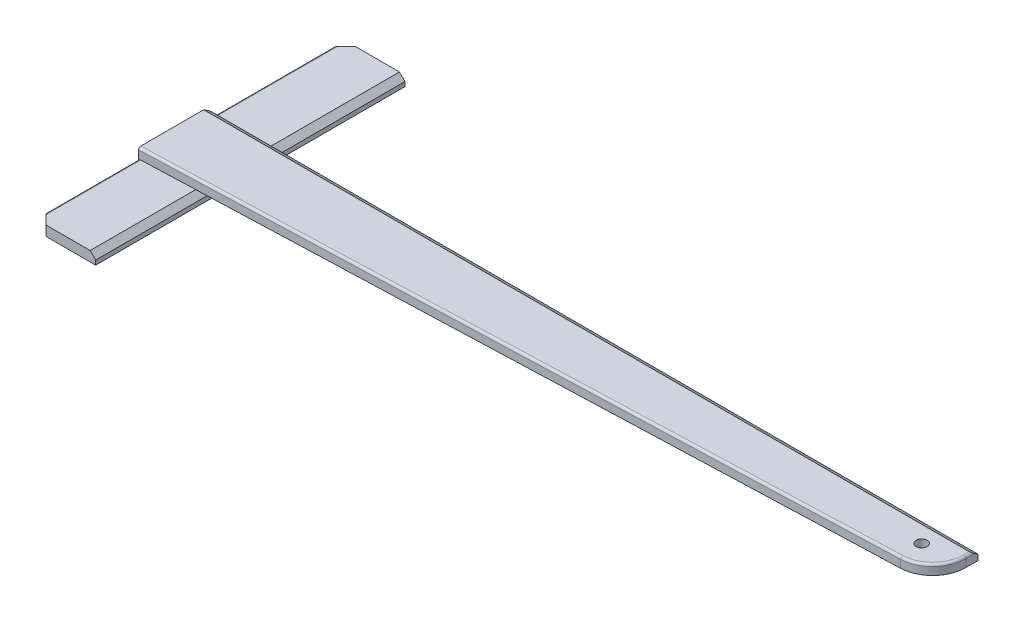
ISO-10303-21;
HEADER;
FILE_DESCRIPTION(('STEP AP214'),'2;1');
FILE_NAME('part.step','',(''),(''),'','','');
FILE_SCHEMA(('AUTOMOTIVE_DESIGN { 1 0 10303 214 1 1 1 1 }'));
ENDSEC;
DATA;
#1=APPLICATION_CONTEXT('core data for automotive mechanical design processes');
#2=APPLICATION_PROTOCOL_DEFINITION('international standard','automotive_design',2000,#1);
#3=PRODUCT_CONTEXT('',#1,'mechanical');
#4=PRODUCT('Part','Part','',(#3));
#5=PRODUCT_RELATED_PRODUCT_CATEGORY('part','',(#4));
#6=PRODUCT_DEFINITION_FORMATION('','',#4);
#7=PRODUCT_DEFINITION_CONTEXT('part definition',#1,'design');
#8=PRODUCT_DEFINITION('design','',#6,#7);
#9=PRODUCT_DEFINITION_SHAPE('','',#8);
#10=(LENGTH_UNIT() NAMED_UNIT(*) SI_UNIT(.MILLI.,.METRE.));
#11=(NAMED_UNIT(*) PLANE_ANGLE_UNIT() SI_UNIT($,.RADIAN.));
#12=(NAMED_UNIT(*) SI_UNIT($,.STERADIAN.) SOLID_ANGLE_UNIT());
#13=UNCERTAINTY_MEASURE_WITH_UNIT(LENGTH_MEASURE(1.E-05),#10,'distance_accuracy_value','');
#14=(GEOMETRIC_REPRESENTATION_CONTEXT(3) GLOBAL_UNCERTAINTY_ASSIGNED_CONTEXT((#13)) GLOBAL_UNIT_ASSIGNED_CONTEXT((#10,
#11,#12)) REPRESENTATION_CONTEXT('',''));
#15=CARTESIAN_POINT('',(0.,0.,0.));
#16=DIRECTION('',(0.,0.,1.));
#17=DIRECTION('',(1.,0.,0.));
#18=AXIS2_PLACEMENT_3D('',#15,#16,#17);
#19=CARTESIAN_POINT('',(0.,228.6,0.));
#20=DIRECTION('',(0.,-1.,0.));
#21=DIRECTION('',(0.,0.,-1.));
#22=AXIS2_PLACEMENT_3D('',#19,#20,#21);
#23=PLANE('',#22);
#24=DIRECTION('',(0.707106781186549,0.,-0.707106781186546));
#25=VECTOR('',#24,1.);
#26=CARTESIAN_POINT('',(-1.28468664278054E-12,228.6,-6858.));
#27=LINE('',#26,#25);
#28=CARTESIAN_POINT('',(253.999999999999,228.6,-7112.));
#29=VERTEX_POINT('',#28);
#30=CARTESIAN_POINT('',(50.7999999999987,228.6,-6908.8));
#31=VERTEX_POINT('',#30);
#32=EDGE_CURVE('E333',#29,#31,#27,.F.);
#33=ORIENTED_EDGE('',*,*,#32,.T.);
#34=DIRECTION('',(0.,0.,1.));
#35=VECTOR('',#34,1.);
#36=CARTESIAN_POINT('',(50.8,228.6,0.));
#37=LINE('',#36,#35);
#38=CARTESIAN_POINT('',(50.7999999999992,228.6,-4032.28768745978));
#39=VERTEX_POINT('',#38);
#40=EDGE_CURVE('E239',#31,#39,#37,.T.);
#41=ORIENTED_EDGE('',*,*,#40,.T.);
#42=DIRECTION('',(-1.,0.,0.));
#43=VECTOR('',#42,1.);
#44=CARTESIAN_POINT('',(-7.55355224836395E-13,228.6,-4032.28768745978));
#45=LINE('',#44,#43);
#46=CARTESIAN_POINT('',(1270.,228.6,-4032.28768745978));
#47=VERTEX_POINT('',#46);
#48=EDGE_CURVE('E195',#47,#39,#45,.T.);
#49=ORIENTED_EDGE('',*,*,#48,.F.);
#50=DIRECTION('',(0.,0.,-1.));
#51=VECTOR('',#50,1.);
#52=CARTESIAN_POINT('',(1270.,228.6,-2.37904933848248E-13));
#53=LINE('',#52,#51);
#54=CARTESIAN_POINT('',(1270.,228.6,-7112.));
#55=VERTEX_POINT('',#54);
#56=EDGE_CURVE('E316',#47,#55,#53,.T.);
#57=ORIENTED_EDGE('',*,*,#56,.T.);
#58=DIRECTION('',(-1.,0.,0.));
#59=VECTOR('',#58,1.);
#60=CARTESIAN_POINT('',(-1.33226762955019E-12,228.6,-7112.));
#61=LINE('',#60,#59);
#62=EDGE_CURVE('E301',#55,#29,#61,.T.);
#63=ORIENTED_EDGE('',*,*,#62,.T.);
#64=EDGE_LOOP('',(#33,#41,#49,#57,#63));
#65=FACE_BOUND('',#64,.T.);
#66=ADVANCED_FACE('F37',(#65),#23,.F.);
#67=DIRECTION('',(0.999353662725428,0.,-0.035947973479332));
#68=VECTOR('',#67,1.);
#69=CARTESIAN_POINT('',(17653.,228.6,-3016.28768745978));
#70=LINE('',#69,#68);
#71=CARTESIAN_POINT('',(50.8000000000024,228.6,-2383.11502558927));
#72=VERTEX_POINT('',#71);
#73=CARTESIAN_POINT('',(1270.,228.6,-2426.97114069719));
#74=VERTEX_POINT('',#73);
#75=EDGE_CURVE('E175',#72,#74,#70,.T.);
#76=ORIENTED_EDGE('',*,*,#75,.F.);
#77=DIRECTION('',(0.,0.,1.));
#78=VECTOR('',#77,1.);
#79=CARTESIAN_POINT('',(50.8,228.6,0.));
#80=LINE('',#79,#78);
#81=CARTESIAN_POINT('',(50.8,228.6,-203.200000000001));
#82=VERTEX_POINT('',#81);
#83=EDGE_CURVE('E251',#72,#82,#80,.T.);
#84=ORIENTED_EDGE('',*,*,#83,.T.);
#85=DIRECTION('',(-0.707106781186546,0.,-0.707106781186549));
#86=VECTOR('',#85,1.);
#87=CARTESIAN_POINT('',(254.,228.6,0.));
#88=LINE('',#87,#86);
#89=CARTESIAN_POINT('',(254.,228.6,0.));
#90=VERTEX_POINT('',#89);
#91=EDGE_CURVE('E202',#82,#90,#88,.F.);
#92=ORIENTED_EDGE('',*,*,#91,.T.);
#93=DIRECTION('',(1.,0.,0.));
#94=VECTOR('',#93,1.);
#95=CARTESIAN_POINT('',(0.,228.6,0.));
#96=LINE('',#95,#94);
#97=CARTESIAN_POINT('',(1270.,228.6,0.));
#98=VERTEX_POINT('',#97);
#99=EDGE_CURVE('E299',#90,#98,#96,.T.);
#100=ORIENTED_EDGE('',*,*,#99,.T.);
#101=EDGE_CURVE('E317',#98,#74,#53,.T.);
#102=ORIENTED_EDGE('',*,*,#101,.T.);
#103=EDGE_LOOP('',(#76,#84,#92,#100,#102));
#104=FACE_BOUND('',#103,.T.);
#105=ADVANCED_FACE('F354',(#104),#23,.F.);
#106=CARTESIAN_POINT('',(0.,228.6,0.));
#107=DIRECTION('',(1.,0.,0.));
#108=DIRECTION('',(0.,0.,-1.));
#109=AXIS2_PLACEMENT_3D('',#106,#107,#108);
#110=PLANE('',#109);
#111=DIRECTION('',(0.,-1.,0.));
#112=VECTOR('',#111,1.);
#113=CARTESIAN_POINT('',(-7.55355224836395E-13,457.2,-4032.28768745978));
#114=LINE('',#113,#112);
#115=CARTESIAN_POINT('',(-7.55355224836395E-13,355.600000000002,-4032.28768745978));
#116=VERTEX_POINT('',#115);
#117=CARTESIAN_POINT('',(-7.55355224836395E-13,177.8,-4032.28768745978));
#118=VERTEX_POINT('',#117);
#119=EDGE_CURVE('E290',#116,#118,#114,.T.);
#120=ORIENTED_EDGE('',*,*,#119,.T.);
#121=DIRECTION('',(0.,0.,1.));
#122=VECTOR('',#121,1.);
#123=CARTESIAN_POINT('',(0.,177.8,0.));
#124=LINE('',#123,#122);
#125=CARTESIAN_POINT('',(-1.28468664278054E-12,177.8,-6858.));
#126=VERTEX_POINT('',#125);
#127=EDGE_CURVE('E247',#118,#126,#124,.F.);
#128=ORIENTED_EDGE('',*,*,#127,.T.);
#129=DIRECTION('',(0.,-1.,0.));
#130=VECTOR('',#129,1.);
#131=CARTESIAN_POINT('',(-1.28468664278054E-12,228.6,-6858.));
#132=LINE('',#131,#130);
#133=CARTESIAN_POINT('',(-1.28468664278054E-12,0.,-6858.));
#134=VERTEX_POINT('',#133);
#135=EDGE_CURVE('E327',#126,#134,#132,.T.);
#136=ORIENTED_EDGE('',*,*,#135,.T.);
#137=DIRECTION('',(0.,0.,1.));
#138=VECTOR('',#137,1.);
#139=CARTESIAN_POINT('',(0.,0.,0.));
#140=LINE('',#139,#138);
#141=CARTESIAN_POINT('',(0.,0.,-254.000000000001));
#142=VERTEX_POINT('',#141);
#143=EDGE_CURVE('E292',#134,#142,#140,.T.);
#144=ORIENTED_EDGE('',*,*,#143,.T.);
#145=DIRECTION('',(0.,1.,0.));
#146=VECTOR('',#145,1.);
#147=CARTESIAN_POINT('',(0.,228.6,-254.000000000001));
#148=LINE('',#147,#146);
#149=CARTESIAN_POINT('',(0.,177.8,-254.000000000001));
#150=VERTEX_POINT('',#149);
#151=EDGE_CURVE('E206',#142,#150,#148,.T.);
#152=ORIENTED_EDGE('',*,*,#151,.T.);
#153=DIRECTION('',(0.,0.,1.));
#154=VECTOR('',#153,1.);
#155=CARTESIAN_POINT('',(0.,177.8,0.));
#156=LINE('',#155,#154);
#157=CARTESIAN_POINT('',(-1.28468664278054E-12,177.8,-2381.28768745978));
#158=VERTEX_POINT('',#157);
#159=EDGE_CURVE('E244',#150,#158,#156,.F.);
#160=ORIENTED_EDGE('',*,*,#159,.T.);
#161=DIRECTION('',(0.,-1.,0.));
#162=VECTOR('',#161,1.);
#163=CARTESIAN_POINT('',(-1.28468664278054E-12,457.2,-2381.28768745978));
#164=LINE('',#163,#162);
#165=CARTESIAN_POINT('',(-1.28468664278054E-12,406.4,-2381.28768745978));
#166=VERTEX_POINT('',#165);
#167=EDGE_CURVE('E185',#166,#158,#164,.T.);
#168=ORIENTED_EDGE('',*,*,#167,.F.);
#169=CARTESIAN_POINT('',(-4.57966997657877E-13,406.4,-2432.12054262884));
#170=DIRECTION('',(1.,0.,0.));
#171=DIRECTION('',(0.,0.,-1.));
#172=AXIS2_PLACEMENT_3D('',#169,#170,#171);
#173=ELLIPSE('',#172,50.8328551690687,50.8);
#174=CARTESIAN_POINT('',(-1.26838898844693E-12,457.2,-2432.12054262884));
#175=VERTEX_POINT('',#174);
#176=EDGE_CURVE('E242',#166,#175,#173,.F.);
#177=ORIENTED_EDGE('',*,*,#176,.T.);
#178=DIRECTION('',(0.,0.,1.));
#179=VECTOR('',#178,1.);
#180=CARTESIAN_POINT('',(-1.28468664278054E-12,457.2,-2381.28768745978));
#181=LINE('',#180,#179);
#182=CARTESIAN_POINT('',(-8.04216586492776E-13,457.2,-3879.88768745978));
#183=VERTEX_POINT('',#182);
#184=EDGE_CURVE('E174',#183,#175,#181,.T.);
#185=ORIENTED_EDGE('',*,*,#184,.F.);
#186=DIRECTION('',(0.,0.554700196225234,0.832050294337841));
#187=VECTOR('',#186,1.);
#188=CARTESIAN_POINT('',(-7.26806632774607E-13,457.2,-3879.88768745978));
#189=LINE('',#188,#187);
#190=EDGE_CURVE('E204',#183,#116,#189,.F.);
#191=ORIENTED_EDGE('',*,*,#190,.T.);
#192=EDGE_LOOP('',(#120,#128,#136,#144,#152,#160,#168,#177,#185,#191));
#193=FACE_BOUND('',#192,.T.);
#194=ADVANCED_FACE('F289',(#193),#110,.F.);
#195=CARTESIAN_POINT('',(0.,228.6,0.));
#196=DIRECTION('',(0.,0.,-1.));
#197=DIRECTION('',(-1.,0.,0.));
#198=AXIS2_PLACEMENT_3D('',#195,#196,#197);
#199=PLANE('',#198);
#200=ORIENTED_EDGE('',*,*,#99,.F.);
#201=DIRECTION('',(0.,-1.,0.));
#202=VECTOR('',#201,1.);
#203=CARTESIAN_POINT('',(254.,228.6,0.));
#204=LINE('',#203,#202);
#205=CARTESIAN_POINT('',(254.,0.,0.));
#206=VERTEX_POINT('',#205);
#207=EDGE_CURVE('E336',#90,#206,#204,.T.);
#208=ORIENTED_EDGE('',*,*,#207,.T.);
#209=DIRECTION('',(1.,0.,0.));
#210=VECTOR('',#209,1.);
#211=CARTESIAN_POINT('',(0.,0.,0.));
#212=LINE('',#211,#210);
#213=CARTESIAN_POINT('',(1397.,0.,0.));
#214=VERTEX_POINT('',#213);
#215=EDGE_CURVE('E295',#206,#214,#212,.T.);
#216=ORIENTED_EDGE('',*,*,#215,.T.);
#217=DIRECTION('',(0.,-1.,0.));
#218=VECTOR('',#217,1.);
#219=CARTESIAN_POINT('',(1397.,228.6,0.));
#220=LINE('',#219,#218);
#221=CARTESIAN_POINT('',(1397.,101.599999999999,0.));
#222=VERTEX_POINT('',#221);
#223=EDGE_CURVE('E313',#222,#214,#220,.T.);
#224=ORIENTED_EDGE('',*,*,#223,.F.);
#225=DIRECTION('',(0.707106781186545,-0.70710678118655,0.));
#226=VECTOR('',#225,1.);
#227=CARTESIAN_POINT('',(1270.,228.6,0.));
#228=LINE('',#227,#226);
#229=EDGE_CURVE('E324',#222,#98,#228,.F.);
#230=ORIENTED_EDGE('',*,*,#229,.T.);
#231=EDGE_LOOP('',(#200,#208,#216,#224,#230));
#232=FACE_BOUND('',#231,.T.);
#233=ADVANCED_FACE('F350',(#232),#199,.F.);
#234=CARTESIAN_POINT('',(1397.,228.6,0.));
#235=DIRECTION('',(-1.,0.,0.));
#236=DIRECTION('',(0.,0.,1.));
#237=AXIS2_PLACEMENT_3D('',#234,#235,#236);
#238=PLANE('',#237);
#239=DIRECTION('',(0.,-1.,0.));
#240=VECTOR('',#239,1.);
#241=CARTESIAN_POINT('',(1397.,228.6,-7112.));
#242=LINE('',#241,#240);
#243=CARTESIAN_POINT('',(1397.,101.599999999999,-7112.));
#244=VERTEX_POINT('',#243);
#245=CARTESIAN_POINT('',(1397.,0.,-7112.));
#246=VERTEX_POINT('',#245);
#247=EDGE_CURVE('E304',#244,#246,#242,.T.);
#248=ORIENTED_EDGE('',*,*,#247,.F.);
#249=DIRECTION('',(0.,0.,1.));
#250=VECTOR('',#249,1.);
#251=CARTESIAN_POINT('',(1397.,101.599999999999,0.));
#252=LINE('',#251,#250);
#253=EDGE_CURVE('E322',#244,#222,#252,.T.);
#254=ORIENTED_EDGE('',*,*,#253,.T.);
#255=ORIENTED_EDGE('',*,*,#223,.T.);
#256=DIRECTION('',(0.,0.,-1.));
#257=VECTOR('',#256,1.);
#258=CARTESIAN_POINT('',(1397.,0.,0.));
#259=LINE('',#258,#257);
#260=EDGE_CURVE('E307',#214,#246,#259,.T.);
#261=ORIENTED_EDGE('',*,*,#260,.T.);
#262=EDGE_LOOP('',(#248,#254,#255,#261));
#263=FACE_BOUND('',#262,.T.);
#264=ADVANCED_FACE('F386',(#263),#238,.F.);
#265=CARTESIAN_POINT('',(-1.33226762955019E-12,228.6,-7112.));
#266=DIRECTION('',(0.,0.,1.));
#267=DIRECTION('',(1.,0.,0.));
#268=AXIS2_PLACEMENT_3D('',#265,#266,#267);
#269=PLANE('',#268);
#270=DIRECTION('',(-1.,0.,0.));
#271=VECTOR('',#270,1.);
#272=CARTESIAN_POINT('',(-1.33226762955019E-12,0.,-7112.));
#273=LINE('',#272,#271);
#274=CARTESIAN_POINT('',(253.999999999999,0.,-7112.));
#275=VERTEX_POINT('',#274);
#276=EDGE_CURVE('E302',#246,#275,#273,.T.);
#277=ORIENTED_EDGE('',*,*,#276,.T.);
#278=DIRECTION('',(0.,1.,0.));
#279=VECTOR('',#278,1.);
#280=CARTESIAN_POINT('',(253.999999999999,228.6,-7112.));
#281=LINE('',#280,#279);
#282=EDGE_CURVE('E331',#275,#29,#281,.T.);
#283=ORIENTED_EDGE('',*,*,#282,.T.);
#284=ORIENTED_EDGE('',*,*,#62,.F.);
#285=DIRECTION('',(-0.707106781186545,0.70710678118655,0.));
#286=VECTOR('',#285,1.);
#287=CARTESIAN_POINT('',(1270.,228.599999999999,-7112.));
#288=LINE('',#287,#286);
#289=EDGE_CURVE('E320',#55,#244,#288,.F.);
#290=ORIENTED_EDGE('',*,*,#289,.T.);
#291=ORIENTED_EDGE('',*,*,#247,.T.);
#292=EDGE_LOOP('',(#277,#283,#284,#290,#291));
#293=FACE_BOUND('',#292,.T.);
#294=ADVANCED_FACE('F383',(#293),#269,.F.);
#295=CARTESIAN_POINT('',(0.,0.,0.));
#296=DIRECTION('',(0.,-1.,0.));
#297=DIRECTION('',(0.,0.,-1.));
#298=AXIS2_PLACEMENT_3D('',#295,#296,#297);
#299=PLANE('',#298);
#300=ORIENTED_EDGE('',*,*,#215,.F.);
#301=DIRECTION('',(0.707106781186546,0.,0.707106781186549));
#302=VECTOR('',#301,1.);
#303=CARTESIAN_POINT('',(127.000000000001,0.,-127.));
#304=LINE('',#303,#302);
#305=EDGE_CURVE('E212',#206,#142,#304,.F.);
#306=ORIENTED_EDGE('',*,*,#305,.T.);
#307=ORIENTED_EDGE('',*,*,#143,.F.);
#308=DIRECTION('',(-0.707106781186549,0.,0.707106781186546));
#309=VECTOR('',#308,1.);
#310=CARTESIAN_POINT('',(-3429.,0.,-3429.00000000001));
#311=LINE('',#310,#309);
#312=EDGE_CURVE('E329',#134,#275,#311,.F.);
#313=ORIENTED_EDGE('',*,*,#312,.T.);
#314=ORIENTED_EDGE('',*,*,#276,.F.);
#315=ORIENTED_EDGE('',*,*,#260,.F.);
#316=EDGE_LOOP('',(#300,#306,#307,#313,#314,#315));
#317=FACE_BOUND('',#316,.T.);
#318=ADVANCED_FACE('F341',(#317),#299,.T.);
#319=CARTESIAN_POINT('',(1270.,228.6,-2.37904933848248E-13));
#320=DIRECTION('',(-0.70710678118655,-0.707106781186545,0.));
#321=DIRECTION('',(0.,0.,-1.));
#322=AXIS2_PLACEMENT_3D('',#319,#320,#321);
#323=PLANE('',#322);
#324=ORIENTED_EDGE('',*,*,#229,.F.);
#325=ORIENTED_EDGE('',*,*,#253,.F.);
#326=ORIENTED_EDGE('',*,*,#289,.F.);
#327=ORIENTED_EDGE('',*,*,#56,.F.);
#328=EDGE_CURVE('E191',#74,#47,#53,.T.);
#329=ORIENTED_EDGE('',*,*,#328,.F.);
#330=ORIENTED_EDGE('',*,*,#101,.F.);
#331=EDGE_LOOP('',(#324,#325,#326,#327,#329,#330));
#332=FACE_BOUND('',#331,.T.);
#333=ADVANCED_FACE('F357',(#332),#323,.F.);
#334=CARTESIAN_POINT('',(-1.28468664278054E-12,228.6,-6858.));
#335=DIRECTION('',(0.707106781186546,0.,0.707106781186549));
#336=DIRECTION('',(0.,-1.,0.));
#337=AXIS2_PLACEMENT_3D('',#334,#335,#336);
#338=PLANE('',#337);
#339=ORIENTED_EDGE('',*,*,#135,.F.);
#340=CARTESIAN_POINT('',(50.7999999999987,177.8,-6908.8));
#341=DIRECTION('',(0.707106781186546,0.,0.707106781186549));
#342=DIRECTION('',(-0.707106781186549,0.,0.707106781186546));
#343=AXIS2_PLACEMENT_3D('',#340,#341,#342);
#344=ELLIPSE('',#343,71.8420489685531,50.8);
#345=EDGE_CURVE('E249',#126,#31,#344,.F.);
#346=ORIENTED_EDGE('',*,*,#345,.T.);
#347=ORIENTED_EDGE('',*,*,#32,.F.);
#348=ORIENTED_EDGE('',*,*,#282,.F.);
#349=ORIENTED_EDGE('',*,*,#312,.F.);
#350=EDGE_LOOP('',(#339,#346,#347,#348,#349));
#351=FACE_BOUND('',#350,.T.);
#352=ADVANCED_FACE('F397',(#351),#338,.F.);
#353=CARTESIAN_POINT('',(254.,228.6,0.));
#354=DIRECTION('',(0.707106781186549,0.,-0.707106781186546));
#355=DIRECTION('',(0.,-1.,0.));
#356=AXIS2_PLACEMENT_3D('',#353,#354,#355);
#357=PLANE('',#356);
#358=ORIENTED_EDGE('',*,*,#91,.F.);
#359=CARTESIAN_POINT('',(50.8,177.8,-203.200000000001));
#360=DIRECTION('',(0.707106781186549,0.,-0.707106781186546));
#361=DIRECTION('',(0.707106781186546,0.,0.707106781186549));
#362=AXIS2_PLACEMENT_3D('',#359,#360,#361);
#363=ELLIPSE('',#362,71.8420489685534,50.8);
#364=EDGE_CURVE('E54',#82,#150,#363,.F.);
#365=ORIENTED_EDGE('',*,*,#364,.T.);
#366=ORIENTED_EDGE('',*,*,#151,.F.);
#367=ORIENTED_EDGE('',*,*,#305,.F.);
#368=ORIENTED_EDGE('',*,*,#207,.F.);
#369=EDGE_LOOP('',(#358,#365,#366,#367,#368));
#370=FACE_BOUND('',#369,.T.);
#371=ADVANCED_FACE('F348',(#370),#357,.F.);
#372=CARTESIAN_POINT('',(-7.55355224836395E-13,457.2,-4032.28768745978));
#373=DIRECTION('',(0.,0.,1.));
#374=DIRECTION('',(1.,0.,0.));
#375=AXIS2_PLACEMENT_3D('',#372,#373,#374);
#376=PLANE('',#375);
#377=ORIENTED_EDGE('',*,*,#119,.F.);
#378=DIRECTION('',(1.,0.,0.));
#379=VECTOR('',#378,1.);
#380=CARTESIAN_POINT('',(-7.55355224836395E-13,355.600000000002,-4032.28768745978));
#381=LINE('',#380,#379);
#382=CARTESIAN_POINT('',(17653.,355.600000000002,-4032.28768745978));
#383=VERTEX_POINT('',#382);
#384=EDGE_CURVE('E184',#116,#383,#381,.T.);
#385=ORIENTED_EDGE('',*,*,#384,.T.);
#386=DIRECTION('',(0.,-1.,0.));
#387=VECTOR('',#386,1.);
#388=CARTESIAN_POINT('',(17653.,457.2,-4032.28768745978));
#389=LINE('',#388,#387);
#390=CARTESIAN_POINT('',(17653.,228.6,-4032.28768745978));
#391=VERTEX_POINT('',#390);
#392=EDGE_CURVE('E167',#383,#391,#389,.T.);
#393=ORIENTED_EDGE('',*,*,#392,.T.);
#394=EDGE_CURVE('E182',#391,#47,#45,.T.);
#395=ORIENTED_EDGE('',*,*,#394,.T.);
#396=ORIENTED_EDGE('',*,*,#48,.T.);
#397=CARTESIAN_POINT('',(50.7999999999992,177.8,-4032.28768745978));
#398=DIRECTION('',(0.,0.,1.));
#399=DIRECTION('',(1.,0.,0.));
#400=AXIS2_PLACEMENT_3D('',#397,#398,#399);
#401=CIRCLE('',#400,50.8);
#402=EDGE_CURVE('E46',#39,#118,#401,.T.);
#403=ORIENTED_EDGE('',*,*,#402,.T.);
#404=EDGE_LOOP('',(#377,#385,#393,#395,#396,#403));
#405=FACE_BOUND('',#404,.T.);
#406=ADVANCED_FACE('F180',(#405),#376,.F.);
#407=CARTESIAN_POINT('',(17653.,457.2,-3016.28768745978));
#408=DIRECTION('',(-0.0359479734793319,0.,-0.999353662725428));
#409=DIRECTION('',(-0.999353662725428,0.,0.035947973479332));
#410=AXIS2_PLACEMENT_3D('',#407,#408,#409);
#411=PLANE('',#410);
#412=DIRECTION('',(0.,-1.,0.));
#413=VECTOR('',#412,1.);
#414=CARTESIAN_POINT('',(16918.3923557912,457.2,-2989.86295205658));
#415=LINE('',#414,#413);
#416=CARTESIAN_POINT('',(16918.3923557912,228.6,-2989.86295205658));
#417=VERTEX_POINT('',#416);
#418=CARTESIAN_POINT('',(16918.3923557912,406.4,-2989.86295205658));
#419=VERTEX_POINT('',#418);
#420=EDGE_CURVE('E223',#417,#419,#415,.F.);
#421=ORIENTED_EDGE('',*,*,#420,.T.);
#422=DIRECTION('',(0.999353662725428,0.,-0.035947973479332));
#423=VECTOR('',#422,1.);
#424=CARTESIAN_POINT('',(17653.,406.4,-3016.28768745978));
#425=LINE('',#424,#423);
#426=EDGE_CURVE('E254',#419,#166,#425,.F.);
#427=ORIENTED_EDGE('',*,*,#426,.T.);
#428=ORIENTED_EDGE('',*,*,#167,.T.);
#429=CARTESIAN_POINT('',(50.7999999999996,177.8,-2383.11502558927));
#430=DIRECTION('',(-0.0359479734793319,0.,-0.999353662725428));
#431=DIRECTION('',(-0.999353662725428,0.,0.035947973479332));
#432=AXIS2_PLACEMENT_3D('',#429,#430,#431);
#433=ELLIPSE('',#432,50.8328551690687,50.8);
#434=EDGE_CURVE('E11',#158,#72,#433,.T.);
#435=ORIENTED_EDGE('',*,*,#434,.T.);
#436=ORIENTED_EDGE('',*,*,#75,.T.);
#437=EDGE_CURVE('E192',#74,#417,#70,.T.);
#438=ORIENTED_EDGE('',*,*,#437,.T.);
#439=EDGE_LOOP('',(#421,#427,#428,#435,#436,#438));
#440=FACE_BOUND('',#439,.T.);
#441=ADVANCED_FACE('F360',(#440),#411,.F.);
#442=CARTESIAN_POINT('',(17653.,457.2,-4032.28768745978));
#443=DIRECTION('',(-1.,0.,0.));
#444=DIRECTION('',(0.,0.,1.));
#445=AXIS2_PLACEMENT_3D('',#442,#443,#444);
#446=PLANE('',#445);
#447=DIRECTION('',(0.,-0.554700196225234,-0.832050294337841));
#448=VECTOR('',#447,1.);
#449=CARTESIAN_POINT('',(17653.,457.2,-3879.88768745978));
#450=LINE('',#449,#448);
#451=CARTESIAN_POINT('',(17653.,406.4,-3956.08768745978));
#452=VERTEX_POINT('',#451);
#453=EDGE_CURVE('E218',#383,#452,#450,.F.);
#454=ORIENTED_EDGE('',*,*,#453,.T.);
#455=DIRECTION('',(0.,0.,-1.));
#456=VECTOR('',#455,1.);
#457=CARTESIAN_POINT('',(17653.,406.4,-4032.28768745978));
#458=LINE('',#457,#456);
#459=CARTESIAN_POINT('',(17653.,406.4,-3751.37044305336));
#460=VERTEX_POINT('',#459);
#461=EDGE_CURVE('E235',#452,#460,#458,.F.);
#462=ORIENTED_EDGE('',*,*,#461,.T.);
#463=DIRECTION('',(0.,-1.,0.));
#464=VECTOR('',#463,1.);
#465=CARTESIAN_POINT('',(17653.,457.2,-3751.37044305336));
#466=LINE('',#465,#464);
#467=CARTESIAN_POINT('',(17653.,228.6,-3751.37044305336));
#468=VERTEX_POINT('',#467);
#469=EDGE_CURVE('E170',#460,#468,#466,.T.);
#470=ORIENTED_EDGE('',*,*,#469,.T.);
#471=DIRECTION('',(0.,0.,-1.));
#472=VECTOR('',#471,1.);
#473=CARTESIAN_POINT('',(17653.,228.6,-4032.28768745978));
#474=LINE('',#473,#472);
#475=EDGE_CURVE('E163',#468,#391,#474,.T.);
#476=ORIENTED_EDGE('',*,*,#475,.T.);
#477=ORIENTED_EDGE('',*,*,#392,.F.);
#478=EDGE_LOOP('',(#454,#462,#470,#476,#477));
#479=FACE_BOUND('',#478,.T.);
#480=ADVANCED_FACE('F166',(#479),#446,.F.);
#481=CARTESIAN_POINT('',(0.,457.2,0.));
#482=DIRECTION('',(0.,-1.,0.));
#483=DIRECTION('',(0.,0.,-1.));
#484=AXIS2_PLACEMENT_3D('',#481,#482,#483);
#485=PLANE('',#484);
#486=CARTESIAN_POINT('',(16891.,457.2,-3497.86295205658));
#487=DIRECTION('',(0.,1.,0.));
#488=DIRECTION('',(0.,0.,1.));
#489=AXIS2_PLACEMENT_3D('',#486,#487,#488);
#490=CIRCLE('',#489,127.000000000003);
#491=CARTESIAN_POINT('',(16891.,457.2,-3370.86295205658));
#492=VERTEX_POINT('',#491);
#493=EDGE_CURVE('E263',#492,#492,#490,.T.);
#494=ORIENTED_EDGE('',*,*,#493,.F.);
#495=EDGE_LOOP('',(#494));
#496=FACE_BOUND('',#495,.T.);
#497=CARTESIAN_POINT('',(16891.,457.2,-3751.37044305336));
#498=DIRECTION('',(0.,-1.,0.));
#499=DIRECTION('',(0.,0.,-1.));
#500=AXIS2_PLACEMENT_3D('',#497,#498,#499);
#501=CIRCLE('',#500,711.2);
#502=CARTESIAN_POINT('',(16916.5661987385,457.2,-3040.63011812303));
#503=VERTEX_POINT('',#502);
#504=CARTESIAN_POINT('',(17602.2,457.2,-3751.37044305336));
#505=VERTEX_POINT('',#504);
#506=EDGE_CURVE('E228',#503,#505,#501,.F.);
#507=ORIENTED_EDGE('',*,*,#506,.T.);
#508=DIRECTION('',(0.,0.,-1.));
#509=VECTOR('',#508,1.);
#510=CARTESIAN_POINT('',(17602.2,457.2,0.));
#511=LINE('',#510,#509);
#512=CARTESIAN_POINT('',(17602.2,457.2,-3879.88768745978));
#513=VERTEX_POINT('',#512);
#514=EDGE_CURVE('E230',#505,#513,#511,.T.);
#515=ORIENTED_EDGE('',*,*,#514,.T.);
#516=DIRECTION('',(-1.,0.,0.));
#517=VECTOR('',#516,1.);
#518=CARTESIAN_POINT('',(0.,457.2,-3879.88768745978));
#519=LINE('',#518,#517);
#520=EDGE_CURVE('E201',#513,#183,#519,.T.);
#521=ORIENTED_EDGE('',*,*,#520,.T.);
#522=ORIENTED_EDGE('',*,*,#184,.T.);
#523=DIRECTION('',(0.999353662725428,0.,-0.035947973479332));
#524=VECTOR('',#523,1.);
#525=CARTESIAN_POINT('',(-87.373295623232,457.2,-2428.97761832585));
#526=LINE('',#525,#524);
#527=EDGE_CURVE('E226',#175,#503,#526,.T.);
#528=ORIENTED_EDGE('',*,*,#527,.T.);
#529=EDGE_LOOP('',(#507,#515,#521,#522,#528));
#530=FACE_BOUND('',#529,.T.);
#531=ADVANCED_FACE('F274',(#496,#530),#485,.F.);
#532=CARTESIAN_POINT('',(0.,228.6,0.));
#533=DIRECTION('',(0.,-1.,0.));
#534=DIRECTION('',(0.,0.,-1.));
#535=AXIS2_PLACEMENT_3D('',#532,#533,#534);
#536=PLANE('',#535);
#537=CARTESIAN_POINT('',(16891.,228.6,-3497.86295205658));
#538=DIRECTION('',(0.,-1.,0.));
#539=DIRECTION('',(0.,0.,-1.));
#540=AXIS2_PLACEMENT_3D('',#537,#538,#539);
#541=CIRCLE('',#540,127.000000000003);
#542=CARTESIAN_POINT('',(16891.,228.6,-3624.86295205659));
#543=VERTEX_POINT('',#542);
#544=EDGE_CURVE('E41',#543,#543,#541,.T.);
#545=ORIENTED_EDGE('',*,*,#544,.F.);
#546=EDGE_LOOP('',(#545));
#547=FACE_BOUND('',#546,.T.);
#548=ORIENTED_EDGE('',*,*,#475,.F.);
#549=CARTESIAN_POINT('',(16891.,228.6,-3751.37044305336));
#550=DIRECTION('',(0.,-1.,0.));
#551=DIRECTION('',(0.,0.,-1.));
#552=AXIS2_PLACEMENT_3D('',#549,#550,#551);
#553=CIRCLE('',#552,762.);
#554=EDGE_CURVE('E221',#468,#417,#553,.T.);
#555=ORIENTED_EDGE('',*,*,#554,.T.);
#556=ORIENTED_EDGE('',*,*,#437,.F.);
#557=ORIENTED_EDGE('',*,*,#328,.T.);
#558=ORIENTED_EDGE('',*,*,#394,.F.);
#559=EDGE_LOOP('',(#548,#555,#556,#557,#558));
#560=FACE_BOUND('',#559,.T.);
#561=ADVANCED_FACE('F188',(#547,#560),#536,.T.);
#562=CARTESIAN_POINT('',(0.,457.2,-3879.88768745978));
#563=DIRECTION('',(0.,-0.832050294337841,0.554700196225234));
#564=DIRECTION('',(-1.,0.,0.));
#565=AXIS2_PLACEMENT_3D('',#562,#563,#564);
#566=PLANE('',#565);
#567=ORIENTED_EDGE('',*,*,#520,.F.);
#568=CARTESIAN_POINT('',(17602.2,406.4,-3956.08768745978));
#569=DIRECTION('',(0.,-0.832050294337841,0.554700196225234));
#570=DIRECTION('',(0.,-0.554700196225234,-0.832050294337841));
#571=AXIS2_PLACEMENT_3D('',#568,#569,#570);
#572=ELLIPSE('',#571,91.5810023967846,50.8);
#573=EDGE_CURVE('E233',#513,#452,#572,.F.);
#574=ORIENTED_EDGE('',*,*,#573,.T.);
#575=ORIENTED_EDGE('',*,*,#453,.F.);
#576=ORIENTED_EDGE('',*,*,#384,.F.);
#577=ORIENTED_EDGE('',*,*,#190,.F.);
#578=EDGE_LOOP('',(#567,#574,#575,#576,#577));
#579=FACE_BOUND('',#578,.T.);
#580=ADVANCED_FACE('F288',(#579),#566,.F.);
#581=CARTESIAN_POINT('',(16891.,457.2,-3751.37044305336));
#582=DIRECTION('',(0.,-1.,0.));
#583=DIRECTION('',(0.,0.,-1.));
#584=AXIS2_PLACEMENT_3D('',#581,#582,#583);
#585=CYLINDRICAL_SURFACE('',#584,762.);
#586=ORIENTED_EDGE('',*,*,#469,.F.);
#587=CARTESIAN_POINT('',(16891.,406.4,-3751.37044305336));
#588=DIRECTION('',(0.,-1.,0.));
#589=DIRECTION('',(0.,0.,-1.));
#590=AXIS2_PLACEMENT_3D('',#587,#588,#589);
#591=CIRCLE('',#590,762.);
#592=EDGE_CURVE('E237',#460,#419,#591,.T.);
#593=ORIENTED_EDGE('',*,*,#592,.T.);
#594=ORIENTED_EDGE('',*,*,#420,.F.);
#595=ORIENTED_EDGE('',*,*,#554,.F.);
#596=EDGE_LOOP('',(#586,#593,#594,#595));
#597=FACE_BOUND('',#596,.T.);
#598=ADVANCED_FACE('F362',(#597),#585,.T.);
#599=CARTESIAN_POINT('',(-87.373295623232,406.4,-2428.97761832585));
#600=DIRECTION('',(0.999353662725428,0.,-0.035947973479332));
#601=DIRECTION('',(-0.035947973479332,0.,-0.999353662725428));
#602=AXIS2_PLACEMENT_3D('',#599,#600,#601);
#603=CYLINDRICAL_SURFACE('',#602,50.8);
#604=ORIENTED_EDGE('',*,*,#176,.F.);
#605=ORIENTED_EDGE('',*,*,#426,.F.);
#606=CARTESIAN_POINT('',(16916.5661987385,406.4,-3040.63011812303));
#607=DIRECTION('',(0.999353662725428,0.,-0.0359479734793443));
#608=DIRECTION('',(-0.0359479734793443,0.,-0.999353662725428));
#609=AXIS2_PLACEMENT_3D('',#606,#607,#608);
#610=CIRCLE('',#609,50.8);
#611=EDGE_CURVE('E193',#503,#419,#610,.T.);
#612=ORIENTED_EDGE('',*,*,#611,.F.);
#613=ORIENTED_EDGE('',*,*,#527,.F.);
#614=EDGE_LOOP('',(#604,#605,#612,#613));
#615=FACE_BOUND('',#614,.T.);
#616=ADVANCED_FACE('F281',(#615),#603,.T.);
#617=CARTESIAN_POINT('',(16891.,406.4,-3751.37044305336));
#618=DIRECTION('',(0.,-1.,0.));
#619=DIRECTION('',(0.,0.,-1.));
#620=AXIS2_PLACEMENT_3D('',#617,#618,#619);
#621=TOROIDAL_SURFACE('',#620,711.2,50.8);
#622=ORIENTED_EDGE('',*,*,#611,.T.);
#623=ORIENTED_EDGE('',*,*,#592,.F.);
#624=CARTESIAN_POINT('',(17602.2,406.4,-3751.37044305336));
#625=DIRECTION('',(0.,0.,-1.));
#626=DIRECTION('',(-1.,0.,0.));
#627=AXIS2_PLACEMENT_3D('',#624,#625,#626);
#628=CIRCLE('',#627,50.8);
#629=EDGE_CURVE('E199',#505,#460,#628,.T.);
#630=ORIENTED_EDGE('',*,*,#629,.F.);
#631=ORIENTED_EDGE('',*,*,#506,.F.);
#632=EDGE_LOOP('',(#622,#623,#630,#631));
#633=FACE_BOUND('',#632,.T.);
#634=ADVANCED_FACE('F286',(#633),#621,.T.);
#635=CARTESIAN_POINT('',(17602.2,406.4,0.));
#636=DIRECTION('',(0.,0.,-1.));
#637=DIRECTION('',(-1.,0.,0.));
#638=AXIS2_PLACEMENT_3D('',#635,#636,#637);
#639=CYLINDRICAL_SURFACE('',#638,50.8);
#640=ORIENTED_EDGE('',*,*,#629,.T.);
#641=ORIENTED_EDGE('',*,*,#461,.F.);
#642=ORIENTED_EDGE('',*,*,#573,.F.);
#643=ORIENTED_EDGE('',*,*,#514,.F.);
#644=EDGE_LOOP('',(#640,#641,#642,#643));
#645=FACE_BOUND('',#644,.T.);
#646=ADVANCED_FACE('F428',(#645),#639,.T.);
#647=CARTESIAN_POINT('',(50.8,177.8,0.));
#648=DIRECTION('',(0.,0.,1.));
#649=DIRECTION('',(1.,0.,0.));
#650=AXIS2_PLACEMENT_3D('',#647,#648,#649);
#651=CYLINDRICAL_SURFACE('',#650,50.8);
#652=ORIENTED_EDGE('',*,*,#345,.F.);
#653=ORIENTED_EDGE('',*,*,#127,.F.);
#654=ORIENTED_EDGE('',*,*,#402,.F.);
#655=ORIENTED_EDGE('',*,*,#40,.F.);
#656=EDGE_LOOP('',(#652,#653,#654,#655));
#657=FACE_BOUND('',#656,.T.);
#658=ADVANCED_FACE('F424',(#657),#651,.T.);
#659=CARTESIAN_POINT('',(50.8,177.8,0.));
#660=DIRECTION('',(0.,0.,1.));
#661=DIRECTION('',(1.,0.,0.));
#662=AXIS2_PLACEMENT_3D('',#659,#660,#661);
#663=CYLINDRICAL_SURFACE('',#662,50.8);
#664=ORIENTED_EDGE('',*,*,#434,.F.);
#665=ORIENTED_EDGE('',*,*,#159,.F.);
#666=ORIENTED_EDGE('',*,*,#364,.F.);
#667=ORIENTED_EDGE('',*,*,#83,.F.);
#668=EDGE_LOOP('',(#664,#665,#666,#667));
#669=FACE_BOUND('',#668,.T.);
#670=ADVANCED_FACE('F39',(#669),#663,.T.);
#671=CARTESIAN_POINT('',(16891.,0.,-3497.86295205658));
#672=DIRECTION('',(0.,1.,0.));
#673=DIRECTION('',(0.,0.,1.));
#674=AXIS2_PLACEMENT_3D('',#671,#672,#673);
#675=CYLINDRICAL_SURFACE('',#674,127.000000000003);
#676=ORIENTED_EDGE('',*,*,#544,.T.);
#677=EDGE_LOOP('',(#676));
#678=FACE_BOUND('',#677,.T.);
#679=ORIENTED_EDGE('',*,*,#493,.T.);
#680=EDGE_LOOP('',(#679));
#681=FACE_BOUND('',#680,.T.);
#682=ADVANCED_FACE('F419',(#678,#681),#675,.F.);
#683=CLOSED_SHELL('',(#66,#105,#194,#233,#264,#294,#318,#333,#352,#371,#406,#441,#480,#531,#561,
#580,#598,#616,#634,#646,#658,#670,#682));
#684=MANIFOLD_SOLID_BREP('B2',#683);
#685=ADVANCED_BREP_SHAPE_REPRESENTATION('',(#18,#684),#14);
#686=SHAPE_DEFINITION_REPRESENTATION(#9,#685);
ENDSEC;
END-ISO-10303-21;
